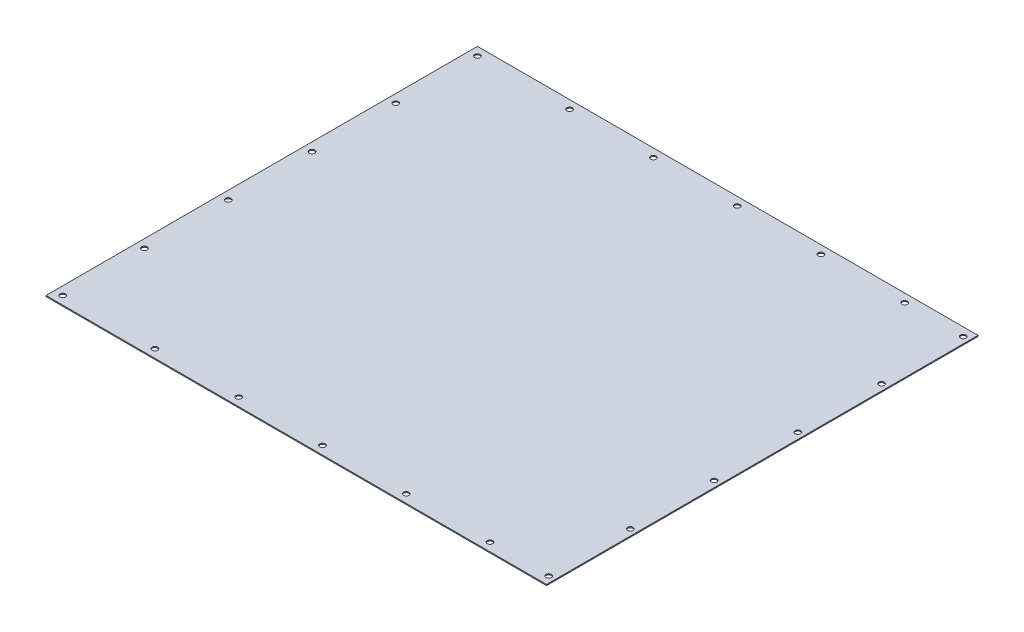
ISO-10303-21;
HEADER;
FILE_DESCRIPTION(('STEP AP214'),'2;1');
FILE_NAME('part.step','',(''),(''),'','','');
FILE_SCHEMA(('AUTOMOTIVE_DESIGN { 1 0 10303 214 1 1 1 1 }'));
ENDSEC;
DATA;
#1=APPLICATION_CONTEXT('core data for automotive mechanical design processes');
#2=APPLICATION_PROTOCOL_DEFINITION('international standard','automotive_design',2000,#1);
#3=PRODUCT_CONTEXT('',#1,'mechanical');
#4=PRODUCT('Part','Part','',(#3));
#5=PRODUCT_RELATED_PRODUCT_CATEGORY('part','',(#4));
#6=PRODUCT_DEFINITION_FORMATION('','',#4);
#7=PRODUCT_DEFINITION_CONTEXT('part definition',#1,'design');
#8=PRODUCT_DEFINITION('design','',#6,#7);
#9=PRODUCT_DEFINITION_SHAPE('','',#8);
#10=(LENGTH_UNIT() NAMED_UNIT(*) SI_UNIT(.MILLI.,.METRE.));
#11=(NAMED_UNIT(*) PLANE_ANGLE_UNIT() SI_UNIT($,.RADIAN.));
#12=(NAMED_UNIT(*) SI_UNIT($,.STERADIAN.) SOLID_ANGLE_UNIT());
#13=UNCERTAINTY_MEASURE_WITH_UNIT(LENGTH_MEASURE(1.E-05),#10,'distance_accuracy_value','');
#14=(GEOMETRIC_REPRESENTATION_CONTEXT(3) GLOBAL_UNCERTAINTY_ASSIGNED_CONTEXT((#13)) GLOBAL_UNIT_ASSIGNED_CONTEXT((#10,
#11,#12)) REPRESENTATION_CONTEXT('',''));
#15=CARTESIAN_POINT('',(0.,0.,0.));
#16=DIRECTION('',(0.,0.,1.));
#17=DIRECTION('',(1.,0.,0.));
#18=AXIS2_PLACEMENT_3D('',#15,#16,#17);
#19=CARTESIAN_POINT('',(749.3,1.5875,-517.525));
#20=DIRECTION('',(0.,1.,0.));
#21=DIRECTION('',(0.,0.,1.));
#22=AXIS2_PLACEMENT_3D('',#19,#20,#21);
#23=CYLINDRICAL_SURFACE('',#22,4.167251);
#24=CARTESIAN_POINT('',(749.3,0.,-517.525));
#25=DIRECTION('',(0.,1.,0.));
#26=DIRECTION('',(0.,0.,1.));
#27=AXIS2_PLACEMENT_3D('',#24,#25,#26);
#28=CIRCLE('',#27,4.167251);
#29=CARTESIAN_POINT('',(749.3,0.,-513.357749));
#30=VERTEX_POINT('',#29);
#31=EDGE_CURVE('E47',#30,#30,#28,.T.);
#32=ORIENTED_EDGE('',*,*,#31,.F.);
#33=EDGE_LOOP('',(#32));
#34=FACE_BOUND('',#33,.T.);
#35=CARTESIAN_POINT('',(749.3,1.5875,-517.525));
#36=DIRECTION('',(0.,1.,0.));
#37=DIRECTION('',(0.,0.,1.));
#38=AXIS2_PLACEMENT_3D('',#35,#36,#37);
#39=CIRCLE('',#38,4.167251);
#40=CARTESIAN_POINT('',(749.3,1.5875,-513.357749));
#41=VERTEX_POINT('',#40);
#42=EDGE_CURVE('E11',#41,#41,#39,.T.);
#43=ORIENTED_EDGE('',*,*,#42,.T.);
#44=EDGE_LOOP('',(#43));
#45=FACE_BOUND('',#44,.T.);
#46=ADVANCED_FACE('F39',(#34,#45),#23,.F.);
#47=CARTESIAN_POINT('',(749.3,1.5875,-390.525));
#48=DIRECTION('',(0.,1.,0.));
#49=DIRECTION('',(0.,0.,1.));
#50=AXIS2_PLACEMENT_3D('',#47,#48,#49);
#51=CYLINDRICAL_SURFACE('',#50,4.167251);
#52=CARTESIAN_POINT('',(749.3,0.,-390.525));
#53=DIRECTION('',(0.,1.,0.));
#54=DIRECTION('',(0.,0.,1.));
#55=AXIS2_PLACEMENT_3D('',#52,#53,#54);
#56=CIRCLE('',#55,4.167251);
#57=CARTESIAN_POINT('',(749.3,0.,-386.357749));
#58=VERTEX_POINT('',#57);
#59=EDGE_CURVE('E201',#58,#58,#56,.T.);
#60=ORIENTED_EDGE('',*,*,#59,.F.);
#61=EDGE_LOOP('',(#60));
#62=FACE_BOUND('',#61,.T.);
#63=CARTESIAN_POINT('',(749.3,1.5875,-390.525));
#64=DIRECTION('',(0.,1.,0.));
#65=DIRECTION('',(0.,0.,1.));
#66=AXIS2_PLACEMENT_3D('',#63,#64,#65);
#67=CIRCLE('',#66,4.167251);
#68=CARTESIAN_POINT('',(749.3,1.5875,-386.357749));
#69=VERTEX_POINT('',#68);
#70=EDGE_CURVE('E204',#69,#69,#67,.T.);
#71=ORIENTED_EDGE('',*,*,#70,.T.);
#72=EDGE_LOOP('',(#71));
#73=FACE_BOUND('',#72,.T.);
#74=ADVANCED_FACE('F213',(#62,#73),#51,.F.);
#75=CARTESIAN_POINT('',(749.3,1.5875,-263.525));
#76=DIRECTION('',(0.,1.,0.));
#77=DIRECTION('',(0.,0.,1.));
#78=AXIS2_PLACEMENT_3D('',#75,#76,#77);
#79=CYLINDRICAL_SURFACE('',#78,4.167251);
#80=CARTESIAN_POINT('',(749.3,0.,-263.525));
#81=DIRECTION('',(0.,1.,0.));
#82=DIRECTION('',(0.,0.,1.));
#83=AXIS2_PLACEMENT_3D('',#80,#81,#82);
#84=CIRCLE('',#83,4.167251);
#85=CARTESIAN_POINT('',(749.3,0.,-259.357749));
#86=VERTEX_POINT('',#85);
#87=EDGE_CURVE('E195',#86,#86,#84,.T.);
#88=ORIENTED_EDGE('',*,*,#87,.F.);
#89=EDGE_LOOP('',(#88));
#90=FACE_BOUND('',#89,.T.);
#91=CARTESIAN_POINT('',(749.3,1.5875,-263.525));
#92=DIRECTION('',(0.,1.,0.));
#93=DIRECTION('',(0.,0.,1.));
#94=AXIS2_PLACEMENT_3D('',#91,#92,#93);
#95=CIRCLE('',#94,4.167251);
#96=CARTESIAN_POINT('',(749.3,1.5875,-259.357749));
#97=VERTEX_POINT('',#96);
#98=EDGE_CURVE('E198',#97,#97,#95,.T.);
#99=ORIENTED_EDGE('',*,*,#98,.T.);
#100=EDGE_LOOP('',(#99));
#101=FACE_BOUND('',#100,.T.);
#102=ADVANCED_FACE('F292',(#90,#101),#79,.F.);
#103=CARTESIAN_POINT('',(749.3,1.5875,-136.525));
#104=DIRECTION('',(0.,1.,0.));
#105=DIRECTION('',(0.,0.,1.));
#106=AXIS2_PLACEMENT_3D('',#103,#104,#105);
#107=CYLINDRICAL_SURFACE('',#106,4.167251);
#108=CARTESIAN_POINT('',(749.3,0.,-136.525));
#109=DIRECTION('',(0.,1.,0.));
#110=DIRECTION('',(0.,0.,1.));
#111=AXIS2_PLACEMENT_3D('',#108,#109,#110);
#112=CIRCLE('',#111,4.167251);
#113=CARTESIAN_POINT('',(749.3,0.,-132.357749));
#114=VERTEX_POINT('',#113);
#115=EDGE_CURVE('E189',#114,#114,#112,.T.);
#116=ORIENTED_EDGE('',*,*,#115,.F.);
#117=EDGE_LOOP('',(#116));
#118=FACE_BOUND('',#117,.T.);
#119=CARTESIAN_POINT('',(749.3,1.5875,-136.525));
#120=DIRECTION('',(0.,1.,0.));
#121=DIRECTION('',(0.,0.,1.));
#122=AXIS2_PLACEMENT_3D('',#119,#120,#121);
#123=CIRCLE('',#122,4.167251);
#124=CARTESIAN_POINT('',(749.3,1.5875,-132.357749));
#125=VERTEX_POINT('',#124);
#126=EDGE_CURVE('E192',#125,#125,#123,.T.);
#127=ORIENTED_EDGE('',*,*,#126,.T.);
#128=EDGE_LOOP('',(#127));
#129=FACE_BOUND('',#128,.T.);
#130=ADVANCED_FACE('F288',(#118,#129),#107,.F.);
#131=CARTESIAN_POINT('',(12.7,1.5875,-517.525));
#132=DIRECTION('',(0.,1.,0.));
#133=DIRECTION('',(0.,0.,1.));
#134=AXIS2_PLACEMENT_3D('',#131,#132,#133);
#135=CYLINDRICAL_SURFACE('',#134,4.167251);
#136=CARTESIAN_POINT('',(12.7,0.,-517.525));
#137=DIRECTION('',(0.,1.,0.));
#138=DIRECTION('',(0.,0.,1.));
#139=AXIS2_PLACEMENT_3D('',#136,#137,#138);
#140=CIRCLE('',#139,4.167251);
#141=CARTESIAN_POINT('',(12.7,0.,-513.357749));
#142=VERTEX_POINT('',#141);
#143=EDGE_CURVE('E183',#142,#142,#140,.T.);
#144=ORIENTED_EDGE('',*,*,#143,.F.);
#145=EDGE_LOOP('',(#144));
#146=FACE_BOUND('',#145,.T.);
#147=CARTESIAN_POINT('',(12.7,1.5875,-517.525));
#148=DIRECTION('',(0.,1.,0.));
#149=DIRECTION('',(0.,0.,1.));
#150=AXIS2_PLACEMENT_3D('',#147,#148,#149);
#151=CIRCLE('',#150,4.167251);
#152=CARTESIAN_POINT('',(12.7,1.5875,-513.357749));
#153=VERTEX_POINT('',#152);
#154=EDGE_CURVE('E186',#153,#153,#151,.T.);
#155=ORIENTED_EDGE('',*,*,#154,.T.);
#156=EDGE_LOOP('',(#155));
#157=FACE_BOUND('',#156,.T.);
#158=ADVANCED_FACE('F284',(#146,#157),#135,.F.);
#159=CARTESIAN_POINT('',(12.7,1.5875,-390.525));
#160=DIRECTION('',(0.,1.,0.));
#161=DIRECTION('',(0.,0.,1.));
#162=AXIS2_PLACEMENT_3D('',#159,#160,#161);
#163=CYLINDRICAL_SURFACE('',#162,4.167251);
#164=CARTESIAN_POINT('',(12.7,0.,-390.525));
#165=DIRECTION('',(0.,1.,0.));
#166=DIRECTION('',(0.,0.,1.));
#167=AXIS2_PLACEMENT_3D('',#164,#165,#166);
#168=CIRCLE('',#167,4.167251);
#169=CARTESIAN_POINT('',(12.7,0.,-386.357749));
#170=VERTEX_POINT('',#169);
#171=EDGE_CURVE('E177',#170,#170,#168,.T.);
#172=ORIENTED_EDGE('',*,*,#171,.F.);
#173=EDGE_LOOP('',(#172));
#174=FACE_BOUND('',#173,.T.);
#175=CARTESIAN_POINT('',(12.7,1.5875,-390.525));
#176=DIRECTION('',(0.,1.,0.));
#177=DIRECTION('',(0.,0.,1.));
#178=AXIS2_PLACEMENT_3D('',#175,#176,#177);
#179=CIRCLE('',#178,4.167251);
#180=CARTESIAN_POINT('',(12.7,1.5875,-386.357749));
#181=VERTEX_POINT('',#180);
#182=EDGE_CURVE('E180',#181,#181,#179,.T.);
#183=ORIENTED_EDGE('',*,*,#182,.T.);
#184=EDGE_LOOP('',(#183));
#185=FACE_BOUND('',#184,.T.);
#186=ADVANCED_FACE('F281',(#174,#185),#163,.F.);
#187=CARTESIAN_POINT('',(660.4,1.5875,-641.35));
#188=DIRECTION('',(0.,1.,0.));
#189=DIRECTION('',(0.,0.,1.));
#190=AXIS2_PLACEMENT_3D('',#187,#188,#189);
#191=CYLINDRICAL_SURFACE('',#190,4.16725100000001);
#192=CARTESIAN_POINT('',(660.4,0.,-641.35));
#193=DIRECTION('',(0.,1.,0.));
#194=DIRECTION('',(0.,0.,1.));
#195=AXIS2_PLACEMENT_3D('',#192,#193,#194);
#196=CIRCLE('',#195,4.16725100000001);
#197=CARTESIAN_POINT('',(660.4,0.,-637.182749));
#198=VERTEX_POINT('',#197);
#199=EDGE_CURVE('E171',#198,#198,#196,.T.);
#200=ORIENTED_EDGE('',*,*,#199,.F.);
#201=EDGE_LOOP('',(#200));
#202=FACE_BOUND('',#201,.T.);
#203=CARTESIAN_POINT('',(660.4,1.5875,-641.35));
#204=DIRECTION('',(0.,1.,0.));
#205=DIRECTION('',(0.,0.,1.));
#206=AXIS2_PLACEMENT_3D('',#203,#204,#205);
#207=CIRCLE('',#206,4.16725100000001);
#208=CARTESIAN_POINT('',(660.4,1.5875,-637.182749));
#209=VERTEX_POINT('',#208);
#210=EDGE_CURVE('E174',#209,#209,#207,.T.);
#211=ORIENTED_EDGE('',*,*,#210,.T.);
#212=EDGE_LOOP('',(#211));
#213=FACE_BOUND('',#212,.T.);
#214=ADVANCED_FACE('F277',(#202,#213),#191,.F.);
#215=CARTESIAN_POINT('',(533.4,1.5875,-641.35));
#216=DIRECTION('',(0.,1.,0.));
#217=DIRECTION('',(0.,0.,1.));
#218=AXIS2_PLACEMENT_3D('',#215,#216,#217);
#219=CYLINDRICAL_SURFACE('',#218,4.16725100000001);
#220=CARTESIAN_POINT('',(533.4,0.,-641.35));
#221=DIRECTION('',(0.,1.,0.));
#222=DIRECTION('',(0.,0.,1.));
#223=AXIS2_PLACEMENT_3D('',#220,#221,#222);
#224=CIRCLE('',#223,4.16725100000001);
#225=CARTESIAN_POINT('',(533.4,0.,-637.182749));
#226=VERTEX_POINT('',#225);
#227=EDGE_CURVE('E165',#226,#226,#224,.T.);
#228=ORIENTED_EDGE('',*,*,#227,.F.);
#229=EDGE_LOOP('',(#228));
#230=FACE_BOUND('',#229,.T.);
#231=CARTESIAN_POINT('',(533.4,1.5875,-641.35));
#232=DIRECTION('',(0.,1.,0.));
#233=DIRECTION('',(0.,0.,1.));
#234=AXIS2_PLACEMENT_3D('',#231,#232,#233);
#235=CIRCLE('',#234,4.16725100000001);
#236=CARTESIAN_POINT('',(533.4,1.5875,-637.182749));
#237=VERTEX_POINT('',#236);
#238=EDGE_CURVE('E168',#237,#237,#235,.T.);
#239=ORIENTED_EDGE('',*,*,#238,.T.);
#240=EDGE_LOOP('',(#239));
#241=FACE_BOUND('',#240,.T.);
#242=ADVANCED_FACE('F273',(#230,#241),#219,.F.);
#243=CARTESIAN_POINT('',(406.4,1.5875,-641.35));
#244=DIRECTION('',(0.,1.,0.));
#245=DIRECTION('',(0.,0.,1.));
#246=AXIS2_PLACEMENT_3D('',#243,#244,#245);
#247=CYLINDRICAL_SURFACE('',#246,4.16725100000001);
#248=CARTESIAN_POINT('',(406.4,0.,-641.35));
#249=DIRECTION('',(0.,1.,0.));
#250=DIRECTION('',(0.,0.,1.));
#251=AXIS2_PLACEMENT_3D('',#248,#249,#250);
#252=CIRCLE('',#251,4.16725100000001);
#253=CARTESIAN_POINT('',(406.4,0.,-637.182749));
#254=VERTEX_POINT('',#253);
#255=EDGE_CURVE('E159',#254,#254,#252,.T.);
#256=ORIENTED_EDGE('',*,*,#255,.F.);
#257=EDGE_LOOP('',(#256));
#258=FACE_BOUND('',#257,.T.);
#259=CARTESIAN_POINT('',(406.4,1.5875,-641.35));
#260=DIRECTION('',(0.,1.,0.));
#261=DIRECTION('',(0.,0.,1.));
#262=AXIS2_PLACEMENT_3D('',#259,#260,#261);
#263=CIRCLE('',#262,4.16725100000001);
#264=CARTESIAN_POINT('',(406.4,1.5875,-637.182749));
#265=VERTEX_POINT('',#264);
#266=EDGE_CURVE('E162',#265,#265,#263,.T.);
#267=ORIENTED_EDGE('',*,*,#266,.T.);
#268=EDGE_LOOP('',(#267));
#269=FACE_BOUND('',#268,.T.);
#270=ADVANCED_FACE('F269',(#258,#269),#247,.F.);
#271=CARTESIAN_POINT('',(279.4,1.5875,-641.35));
#272=DIRECTION('',(0.,1.,0.));
#273=DIRECTION('',(0.,0.,1.));
#274=AXIS2_PLACEMENT_3D('',#271,#272,#273);
#275=CYLINDRICAL_SURFACE('',#274,4.16725100000001);
#276=CARTESIAN_POINT('',(279.4,0.,-641.35));
#277=DIRECTION('',(0.,1.,0.));
#278=DIRECTION('',(0.,0.,1.));
#279=AXIS2_PLACEMENT_3D('',#276,#277,#278);
#280=CIRCLE('',#279,4.16725100000001);
#281=CARTESIAN_POINT('',(279.4,0.,-637.182749));
#282=VERTEX_POINT('',#281);
#283=EDGE_CURVE('E153',#282,#282,#280,.T.);
#284=ORIENTED_EDGE('',*,*,#283,.F.);
#285=EDGE_LOOP('',(#284));
#286=FACE_BOUND('',#285,.T.);
#287=CARTESIAN_POINT('',(279.4,1.5875,-641.35));
#288=DIRECTION('',(0.,1.,0.));
#289=DIRECTION('',(0.,0.,1.));
#290=AXIS2_PLACEMENT_3D('',#287,#288,#289);
#291=CIRCLE('',#290,4.16725100000001);
#292=CARTESIAN_POINT('',(279.4,1.5875,-637.182749));
#293=VERTEX_POINT('',#292);
#294=EDGE_CURVE('E156',#293,#293,#291,.T.);
#295=ORIENTED_EDGE('',*,*,#294,.T.);
#296=EDGE_LOOP('',(#295));
#297=FACE_BOUND('',#296,.T.);
#298=ADVANCED_FACE('F265',(#286,#297),#275,.F.);
#299=CARTESIAN_POINT('',(152.4,1.5875,-641.35));
#300=DIRECTION('',(0.,1.,0.));
#301=DIRECTION('',(0.,0.,1.));
#302=AXIS2_PLACEMENT_3D('',#299,#300,#301);
#303=CYLINDRICAL_SURFACE('',#302,4.16725100000001);
#304=CARTESIAN_POINT('',(152.4,0.,-641.35));
#305=DIRECTION('',(0.,1.,0.));
#306=DIRECTION('',(0.,0.,1.));
#307=AXIS2_PLACEMENT_3D('',#304,#305,#306);
#308=CIRCLE('',#307,4.16725100000001);
#309=CARTESIAN_POINT('',(152.4,0.,-637.182749));
#310=VERTEX_POINT('',#309);
#311=EDGE_CURVE('E147',#310,#310,#308,.T.);
#312=ORIENTED_EDGE('',*,*,#311,.F.);
#313=EDGE_LOOP('',(#312));
#314=FACE_BOUND('',#313,.T.);
#315=CARTESIAN_POINT('',(152.4,1.5875,-641.35));
#316=DIRECTION('',(0.,1.,0.));
#317=DIRECTION('',(0.,0.,1.));
#318=AXIS2_PLACEMENT_3D('',#315,#316,#317);
#319=CIRCLE('',#318,4.16725100000001);
#320=CARTESIAN_POINT('',(152.4,1.5875,-637.182749));
#321=VERTEX_POINT('',#320);
#322=EDGE_CURVE('E150',#321,#321,#319,.T.);
#323=ORIENTED_EDGE('',*,*,#322,.T.);
#324=EDGE_LOOP('',(#323));
#325=FACE_BOUND('',#324,.T.);
#326=ADVANCED_FACE('F261',(#314,#325),#303,.F.);
#327=CARTESIAN_POINT('',(660.4,1.5875,-12.7));
#328=DIRECTION('',(0.,1.,0.));
#329=DIRECTION('',(0.,0.,1.));
#330=AXIS2_PLACEMENT_3D('',#327,#328,#329);
#331=CYLINDRICAL_SURFACE('',#330,4.16725100000001);
#332=CARTESIAN_POINT('',(660.4,0.,-12.7));
#333=DIRECTION('',(0.,1.,0.));
#334=DIRECTION('',(0.,0.,1.));
#335=AXIS2_PLACEMENT_3D('',#332,#333,#334);
#336=CIRCLE('',#335,4.16725100000001);
#337=CARTESIAN_POINT('',(660.4,0.,-8.53274899999999));
#338=VERTEX_POINT('',#337);
#339=EDGE_CURVE('E141',#338,#338,#336,.T.);
#340=ORIENTED_EDGE('',*,*,#339,.F.);
#341=EDGE_LOOP('',(#340));
#342=FACE_BOUND('',#341,.T.);
#343=CARTESIAN_POINT('',(660.4,1.5875,-12.7));
#344=DIRECTION('',(0.,1.,0.));
#345=DIRECTION('',(0.,0.,1.));
#346=AXIS2_PLACEMENT_3D('',#343,#344,#345);
#347=CIRCLE('',#346,4.16725100000001);
#348=CARTESIAN_POINT('',(660.4,1.5875,-8.53274899999999));
#349=VERTEX_POINT('',#348);
#350=EDGE_CURVE('E144',#349,#349,#347,.T.);
#351=ORIENTED_EDGE('',*,*,#350,.T.);
#352=EDGE_LOOP('',(#351));
#353=FACE_BOUND('',#352,.T.);
#354=ADVANCED_FACE('F257',(#342,#353),#331,.F.);
#355=CARTESIAN_POINT('',(533.4,1.5875,-12.7));
#356=DIRECTION('',(0.,1.,0.));
#357=DIRECTION('',(0.,0.,1.));
#358=AXIS2_PLACEMENT_3D('',#355,#356,#357);
#359=CYLINDRICAL_SURFACE('',#358,4.16725100000001);
#360=CARTESIAN_POINT('',(533.4,0.,-12.7));
#361=DIRECTION('',(0.,1.,0.));
#362=DIRECTION('',(0.,0.,1.));
#363=AXIS2_PLACEMENT_3D('',#360,#361,#362);
#364=CIRCLE('',#363,4.16725100000001);
#365=CARTESIAN_POINT('',(533.4,0.,-8.53274899999999));
#366=VERTEX_POINT('',#365);
#367=EDGE_CURVE('E135',#366,#366,#364,.T.);
#368=ORIENTED_EDGE('',*,*,#367,.F.);
#369=EDGE_LOOP('',(#368));
#370=FACE_BOUND('',#369,.T.);
#371=CARTESIAN_POINT('',(533.4,1.5875,-12.7));
#372=DIRECTION('',(0.,1.,0.));
#373=DIRECTION('',(0.,0.,1.));
#374=AXIS2_PLACEMENT_3D('',#371,#372,#373);
#375=CIRCLE('',#374,4.16725100000001);
#376=CARTESIAN_POINT('',(533.4,1.5875,-8.53274899999999));
#377=VERTEX_POINT('',#376);
#378=EDGE_CURVE('E138',#377,#377,#375,.T.);
#379=ORIENTED_EDGE('',*,*,#378,.T.);
#380=EDGE_LOOP('',(#379));
#381=FACE_BOUND('',#380,.T.);
#382=ADVANCED_FACE('F253',(#370,#381),#359,.F.);
#383=CARTESIAN_POINT('',(406.4,1.5875,-12.7));
#384=DIRECTION('',(0.,1.,0.));
#385=DIRECTION('',(0.,0.,1.));
#386=AXIS2_PLACEMENT_3D('',#383,#384,#385);
#387=CYLINDRICAL_SURFACE('',#386,4.16725100000001);
#388=CARTESIAN_POINT('',(406.4,0.,-12.7));
#389=DIRECTION('',(0.,1.,0.));
#390=DIRECTION('',(0.,0.,1.));
#391=AXIS2_PLACEMENT_3D('',#388,#389,#390);
#392=CIRCLE('',#391,4.16725100000001);
#393=CARTESIAN_POINT('',(406.4,0.,-8.53274899999999));
#394=VERTEX_POINT('',#393);
#395=EDGE_CURVE('E129',#394,#394,#392,.T.);
#396=ORIENTED_EDGE('',*,*,#395,.F.);
#397=EDGE_LOOP('',(#396));
#398=FACE_BOUND('',#397,.T.);
#399=CARTESIAN_POINT('',(406.4,1.5875,-12.7));
#400=DIRECTION('',(0.,1.,0.));
#401=DIRECTION('',(0.,0.,1.));
#402=AXIS2_PLACEMENT_3D('',#399,#400,#401);
#403=CIRCLE('',#402,4.16725100000001);
#404=CARTESIAN_POINT('',(406.4,1.5875,-8.53274899999999));
#405=VERTEX_POINT('',#404);
#406=EDGE_CURVE('E132',#405,#405,#403,.T.);
#407=ORIENTED_EDGE('',*,*,#406,.T.);
#408=EDGE_LOOP('',(#407));
#409=FACE_BOUND('',#408,.T.);
#410=ADVANCED_FACE('F249',(#398,#409),#387,.F.);
#411=CARTESIAN_POINT('',(749.3,1.5875,-641.35));
#412=DIRECTION('',(0.,1.,0.));
#413=DIRECTION('',(0.,0.,1.));
#414=AXIS2_PLACEMENT_3D('',#411,#412,#413);
#415=CYLINDRICAL_SURFACE('',#414,4.167251);
#416=CARTESIAN_POINT('',(749.3,0.,-641.35));
#417=DIRECTION('',(0.,1.,0.));
#418=DIRECTION('',(0.,0.,1.));
#419=AXIS2_PLACEMENT_3D('',#416,#417,#418);
#420=CIRCLE('',#419,4.167251);
#421=CARTESIAN_POINT('',(749.3,0.,-637.182749));
#422=VERTEX_POINT('',#421);
#423=EDGE_CURVE('E123',#422,#422,#420,.T.);
#424=ORIENTED_EDGE('',*,*,#423,.F.);
#425=EDGE_LOOP('',(#424));
#426=FACE_BOUND('',#425,.T.);
#427=CARTESIAN_POINT('',(749.3,1.5875,-641.35));
#428=DIRECTION('',(0.,1.,0.));
#429=DIRECTION('',(0.,0.,1.));
#430=AXIS2_PLACEMENT_3D('',#427,#428,#429);
#431=CIRCLE('',#430,4.167251);
#432=CARTESIAN_POINT('',(749.3,1.5875,-637.182749));
#433=VERTEX_POINT('',#432);
#434=EDGE_CURVE('E126',#433,#433,#431,.T.);
#435=ORIENTED_EDGE('',*,*,#434,.T.);
#436=EDGE_LOOP('',(#435));
#437=FACE_BOUND('',#436,.T.);
#438=ADVANCED_FACE('F245',(#426,#437),#415,.F.);
#439=CARTESIAN_POINT('',(12.7,1.5875,-641.35));
#440=DIRECTION('',(0.,1.,0.));
#441=DIRECTION('',(0.,0.,1.));
#442=AXIS2_PLACEMENT_3D('',#439,#440,#441);
#443=CYLINDRICAL_SURFACE('',#442,4.167251);
#444=CARTESIAN_POINT('',(12.7,0.,-641.35));
#445=DIRECTION('',(0.,1.,0.));
#446=DIRECTION('',(0.,0.,1.));
#447=AXIS2_PLACEMENT_3D('',#444,#445,#446);
#448=CIRCLE('',#447,4.167251);
#449=CARTESIAN_POINT('',(12.7,0.,-637.182749));
#450=VERTEX_POINT('',#449);
#451=EDGE_CURVE('E117',#450,#450,#448,.T.);
#452=ORIENTED_EDGE('',*,*,#451,.F.);
#453=EDGE_LOOP('',(#452));
#454=FACE_BOUND('',#453,.T.);
#455=CARTESIAN_POINT('',(12.7,1.5875,-641.35));
#456=DIRECTION('',(0.,1.,0.));
#457=DIRECTION('',(0.,0.,1.));
#458=AXIS2_PLACEMENT_3D('',#455,#456,#457);
#459=CIRCLE('',#458,4.167251);
#460=CARTESIAN_POINT('',(12.7,1.5875,-637.182749));
#461=VERTEX_POINT('',#460);
#462=EDGE_CURVE('E120',#461,#461,#459,.T.);
#463=ORIENTED_EDGE('',*,*,#462,.T.);
#464=EDGE_LOOP('',(#463));
#465=FACE_BOUND('',#464,.T.);
#466=ADVANCED_FACE('F241',(#454,#465),#443,.F.);
#467=CARTESIAN_POINT('',(0.,1.5875,0.));
#468=DIRECTION('',(1.,0.,0.));
#469=DIRECTION('',(0.,0.,-1.));
#470=AXIS2_PLACEMENT_3D('',#467,#468,#469);
#471=PLANE('',#470);
#472=DIRECTION('',(0.,0.,1.));
#473=VECTOR('',#472,1.);
#474=CARTESIAN_POINT('',(0.,0.,0.));
#475=LINE('',#474,#473);
#476=CARTESIAN_POINT('',(0.,0.,-654.05));
#477=VERTEX_POINT('',#476);
#478=CARTESIAN_POINT('',(0.,0.,0.));
#479=VERTEX_POINT('',#478);
#480=EDGE_CURVE('E107',#477,#479,#475,.T.);
#481=ORIENTED_EDGE('',*,*,#480,.T.);
#482=DIRECTION('',(0.,-1.,0.));
#483=VECTOR('',#482,1.);
#484=CARTESIAN_POINT('',(0.,1.5875,0.));
#485=LINE('',#484,#483);
#486=CARTESIAN_POINT('',(0.,1.5875,0.));
#487=VERTEX_POINT('',#486);
#488=EDGE_CURVE('E98',#487,#479,#485,.T.);
#489=ORIENTED_EDGE('',*,*,#488,.F.);
#490=DIRECTION('',(0.,0.,1.));
#491=VECTOR('',#490,1.);
#492=CARTESIAN_POINT('',(0.,1.5875,0.));
#493=LINE('',#492,#491);
#494=CARTESIAN_POINT('',(0.,1.5875,-654.05));
#495=VERTEX_POINT('',#494);
#496=EDGE_CURVE('E92',#495,#487,#493,.T.);
#497=ORIENTED_EDGE('',*,*,#496,.F.);
#498=DIRECTION('',(0.,-1.,0.));
#499=VECTOR('',#498,1.);
#500=CARTESIAN_POINT('',(0.,1.5875,-654.05));
#501=LINE('',#500,#499);
#502=EDGE_CURVE('E103',#495,#477,#501,.T.);
#503=ORIENTED_EDGE('',*,*,#502,.T.);
#504=EDGE_LOOP('',(#481,#489,#497,#503));
#505=FACE_BOUND('',#504,.T.);
#506=ADVANCED_FACE('F238',(#505),#471,.F.);
#507=CARTESIAN_POINT('',(0.,1.5875,0.));
#508=DIRECTION('',(0.,0.,-1.));
#509=DIRECTION('',(-1.,0.,0.));
#510=AXIS2_PLACEMENT_3D('',#507,#508,#509);
#511=PLANE('',#510);
#512=DIRECTION('',(1.,0.,0.));
#513=VECTOR('',#512,1.);
#514=CARTESIAN_POINT('',(0.,0.,0.));
#515=LINE('',#514,#513);
#516=CARTESIAN_POINT('',(758.825,0.,0.));
#517=VERTEX_POINT('',#516);
#518=EDGE_CURVE('E97',#479,#517,#515,.T.);
#519=ORIENTED_EDGE('',*,*,#518,.T.);
#520=DIRECTION('',(0.,-1.,0.));
#521=VECTOR('',#520,1.);
#522=CARTESIAN_POINT('',(758.825,1.5875,0.));
#523=LINE('',#522,#521);
#524=CARTESIAN_POINT('',(758.825,1.5875,0.));
#525=VERTEX_POINT('',#524);
#526=EDGE_CURVE('E95',#525,#517,#523,.T.);
#527=ORIENTED_EDGE('',*,*,#526,.F.);
#528=DIRECTION('',(1.,0.,0.));
#529=VECTOR('',#528,1.);
#530=CARTESIAN_POINT('',(0.,1.5875,0.));
#531=LINE('',#530,#529);
#532=EDGE_CURVE('E86',#487,#525,#531,.T.);
#533=ORIENTED_EDGE('',*,*,#532,.F.);
#534=ORIENTED_EDGE('',*,*,#488,.T.);
#535=EDGE_LOOP('',(#519,#527,#533,#534));
#536=FACE_BOUND('',#535,.T.);
#537=ADVANCED_FACE('F96',(#536),#511,.F.);
#538=CARTESIAN_POINT('',(758.825,1.5875,0.));
#539=DIRECTION('',(-1.,0.,0.));
#540=DIRECTION('',(0.,0.,1.));
#541=AXIS2_PLACEMENT_3D('',#538,#539,#540);
#542=PLANE('',#541);
#543=DIRECTION('',(0.,0.,-1.));
#544=VECTOR('',#543,1.);
#545=CARTESIAN_POINT('',(758.825,0.,0.));
#546=LINE('',#545,#544);
#547=CARTESIAN_POINT('',(758.825,0.,-654.05));
#548=VERTEX_POINT('',#547);
#549=EDGE_CURVE('E72',#517,#548,#546,.T.);
#550=ORIENTED_EDGE('',*,*,#549,.T.);
#551=DIRECTION('',(0.,-1.,0.));
#552=VECTOR('',#551,1.);
#553=CARTESIAN_POINT('',(758.825,1.5875,-654.05));
#554=LINE('',#553,#552);
#555=CARTESIAN_POINT('',(758.825,1.5875,-654.05));
#556=VERTEX_POINT('',#555);
#557=EDGE_CURVE('E99',#556,#548,#554,.T.);
#558=ORIENTED_EDGE('',*,*,#557,.F.);
#559=DIRECTION('',(0.,0.,-1.));
#560=VECTOR('',#559,1.);
#561=CARTESIAN_POINT('',(758.825,1.5875,0.));
#562=LINE('',#561,#560);
#563=EDGE_CURVE('E90',#525,#556,#562,.T.);
#564=ORIENTED_EDGE('',*,*,#563,.F.);
#565=ORIENTED_EDGE('',*,*,#526,.T.);
#566=EDGE_LOOP('',(#550,#558,#564,#565));
#567=FACE_BOUND('',#566,.T.);
#568=ADVANCED_FACE('F101',(#567),#542,.F.);
#569=CARTESIAN_POINT('',(0.,1.5875,-654.05));
#570=DIRECTION('',(0.,0.,1.));
#571=DIRECTION('',(1.,0.,0.));
#572=AXIS2_PLACEMENT_3D('',#569,#570,#571);
#573=PLANE('',#572);
#574=DIRECTION('',(-1.,0.,0.));
#575=VECTOR('',#574,1.);
#576=CARTESIAN_POINT('',(0.,0.,-654.05));
#577=LINE('',#576,#575);
#578=EDGE_CURVE('E78',#548,#477,#577,.T.);
#579=ORIENTED_EDGE('',*,*,#578,.T.);
#580=ORIENTED_EDGE('',*,*,#502,.F.);
#581=DIRECTION('',(-1.,0.,0.));
#582=VECTOR('',#581,1.);
#583=CARTESIAN_POINT('',(0.,1.5875,-654.05));
#584=LINE('',#583,#582);
#585=EDGE_CURVE('E55',#556,#495,#584,.T.);
#586=ORIENTED_EDGE('',*,*,#585,.F.);
#587=ORIENTED_EDGE('',*,*,#557,.T.);
#588=EDGE_LOOP('',(#579,#580,#586,#587));
#589=FACE_BOUND('',#588,.T.);
#590=ADVANCED_FACE('F217',(#589),#573,.F.);
#591=CARTESIAN_POINT('',(0.,1.5875,0.));
#592=DIRECTION('',(0.,-1.,0.));
#593=DIRECTION('',(0.,0.,-1.));
#594=AXIS2_PLACEMENT_3D('',#591,#592,#593);
#595=PLANE('',#594);
#596=CARTESIAN_POINT('',(12.7,1.5875,-263.525));
#597=DIRECTION('',(0.,1.,0.));
#598=DIRECTION('',(0.,0.,1.));
#599=AXIS2_PLACEMENT_3D('',#596,#597,#598);
#600=CIRCLE('',#599,4.167251);
#601=CARTESIAN_POINT('',(12.7,1.5875,-259.357749));
#602=VERTEX_POINT('',#601);
#603=EDGE_CURVE('E426',#602,#602,#600,.T.);
#604=ORIENTED_EDGE('',*,*,#603,.F.);
#605=EDGE_LOOP('',(#604));
#606=FACE_BOUND('',#605,.T.);
#607=CARTESIAN_POINT('',(12.7,1.5875,-136.525));
#608=DIRECTION('',(0.,1.,0.));
#609=DIRECTION('',(0.,0.,1.));
#610=AXIS2_PLACEMENT_3D('',#607,#608,#609);
#611=CIRCLE('',#610,4.167251);
#612=CARTESIAN_POINT('',(12.7,1.5875,-132.357749));
#613=VERTEX_POINT('',#612);
#614=EDGE_CURVE('E425',#613,#613,#611,.T.);
#615=ORIENTED_EDGE('',*,*,#614,.F.);
#616=EDGE_LOOP('',(#615));
#617=FACE_BOUND('',#616,.T.);
#618=CARTESIAN_POINT('',(279.4,1.5875,-12.7));
#619=DIRECTION('',(0.,1.,0.));
#620=DIRECTION('',(0.,0.,1.));
#621=AXIS2_PLACEMENT_3D('',#618,#619,#620);
#622=CIRCLE('',#621,4.16725100000001);
#623=CARTESIAN_POINT('',(279.4,1.5875,-8.53274899999999));
#624=VERTEX_POINT('',#623);
#625=EDGE_CURVE('E437',#624,#624,#622,.T.);
#626=ORIENTED_EDGE('',*,*,#625,.F.);
#627=EDGE_LOOP('',(#626));
#628=FACE_BOUND('',#627,.T.);
#629=CARTESIAN_POINT('',(152.4,1.5875,-12.7));
#630=DIRECTION('',(0.,1.,0.));
#631=DIRECTION('',(0.,0.,1.));
#632=AXIS2_PLACEMENT_3D('',#629,#630,#631);
#633=CIRCLE('',#632,4.16725100000001);
#634=CARTESIAN_POINT('',(152.4,1.5875,-8.53274899999999));
#635=VERTEX_POINT('',#634);
#636=EDGE_CURVE('E440',#635,#635,#633,.T.);
#637=ORIENTED_EDGE('',*,*,#636,.F.);
#638=EDGE_LOOP('',(#637));
#639=FACE_BOUND('',#638,.T.);
#640=CARTESIAN_POINT('',(749.3,1.5875,-12.7));
#641=DIRECTION('',(0.,1.,0.));
#642=DIRECTION('',(0.,0.,1.));
#643=AXIS2_PLACEMENT_3D('',#640,#641,#642);
#644=CIRCLE('',#643,4.167251);
#645=CARTESIAN_POINT('',(749.3,1.5875,-8.532749));
#646=VERTEX_POINT('',#645);
#647=EDGE_CURVE('E449',#646,#646,#644,.T.);
#648=ORIENTED_EDGE('',*,*,#647,.F.);
#649=EDGE_LOOP('',(#648));
#650=FACE_BOUND('',#649,.T.);
#651=CARTESIAN_POINT('',(12.7,1.5875,-12.7));
#652=DIRECTION('',(0.,1.,0.));
#653=DIRECTION('',(0.,0.,1.));
#654=AXIS2_PLACEMENT_3D('',#651,#652,#653);
#655=CIRCLE('',#654,4.167251);
#656=CARTESIAN_POINT('',(12.7,1.5875,-8.532749));
#657=VERTEX_POINT('',#656);
#658=EDGE_CURVE('E452',#657,#657,#655,.T.);
#659=ORIENTED_EDGE('',*,*,#658,.F.);
#660=EDGE_LOOP('',(#659));
#661=FACE_BOUND('',#660,.T.);
#662=ORIENTED_EDGE('',*,*,#496,.T.);
#663=ORIENTED_EDGE('',*,*,#532,.T.);
#664=ORIENTED_EDGE('',*,*,#563,.T.);
#665=ORIENTED_EDGE('',*,*,#585,.T.);
#666=EDGE_LOOP('',(#662,#663,#664,#665));
#667=FACE_BOUND('',#666,.T.);
#668=ORIENTED_EDGE('',*,*,#462,.F.);
#669=EDGE_LOOP('',(#668));
#670=FACE_BOUND('',#669,.T.);
#671=ORIENTED_EDGE('',*,*,#434,.F.);
#672=EDGE_LOOP('',(#671));
#673=FACE_BOUND('',#672,.T.);
#674=ORIENTED_EDGE('',*,*,#406,.F.);
#675=EDGE_LOOP('',(#674));
#676=FACE_BOUND('',#675,.T.);
#677=ORIENTED_EDGE('',*,*,#378,.F.);
#678=EDGE_LOOP('',(#677));
#679=FACE_BOUND('',#678,.T.);
#680=ORIENTED_EDGE('',*,*,#350,.F.);
#681=EDGE_LOOP('',(#680));
#682=FACE_BOUND('',#681,.T.);
#683=ORIENTED_EDGE('',*,*,#322,.F.);
#684=EDGE_LOOP('',(#683));
#685=FACE_BOUND('',#684,.T.);
#686=ORIENTED_EDGE('',*,*,#294,.F.);
#687=EDGE_LOOP('',(#686));
#688=FACE_BOUND('',#687,.T.);
#689=ORIENTED_EDGE('',*,*,#266,.F.);
#690=EDGE_LOOP('',(#689));
#691=FACE_BOUND('',#690,.T.);
#692=ORIENTED_EDGE('',*,*,#238,.F.);
#693=EDGE_LOOP('',(#692));
#694=FACE_BOUND('',#693,.T.);
#695=ORIENTED_EDGE('',*,*,#210,.F.);
#696=EDGE_LOOP('',(#695));
#697=FACE_BOUND('',#696,.T.);
#698=ORIENTED_EDGE('',*,*,#182,.F.);
#699=EDGE_LOOP('',(#698));
#700=FACE_BOUND('',#699,.T.);
#701=ORIENTED_EDGE('',*,*,#154,.F.);
#702=EDGE_LOOP('',(#701));
#703=FACE_BOUND('',#702,.T.);
#704=ORIENTED_EDGE('',*,*,#126,.F.);
#705=EDGE_LOOP('',(#704));
#706=FACE_BOUND('',#705,.T.);
#707=ORIENTED_EDGE('',*,*,#98,.F.);
#708=EDGE_LOOP('',(#707));
#709=FACE_BOUND('',#708,.T.);
#710=ORIENTED_EDGE('',*,*,#70,.F.);
#711=EDGE_LOOP('',(#710));
#712=FACE_BOUND('',#711,.T.);
#713=ORIENTED_EDGE('',*,*,#42,.F.);
#714=EDGE_LOOP('',(#713));
#715=FACE_BOUND('',#714,.T.);
#716=ADVANCED_FACE('F87',(#606,#617,#628,#639,#650,#661,#667,#670,#673,#676,#679,#682,#685,#688,
#691,#694,#697,#700,#703,#706,#709,#712,#715),#595,.F.);
#717=CARTESIAN_POINT('',(0.,0.,0.));
#718=DIRECTION('',(0.,-1.,0.));
#719=DIRECTION('',(0.,0.,-1.));
#720=AXIS2_PLACEMENT_3D('',#717,#718,#719);
#721=PLANE('',#720);
#722=CARTESIAN_POINT('',(12.7,0.,-263.525));
#723=DIRECTION('',(0.,1.,0.));
#724=DIRECTION('',(0.,0.,1.));
#725=AXIS2_PLACEMENT_3D('',#722,#723,#724);
#726=CIRCLE('',#725,4.167251);
#727=CARTESIAN_POINT('',(12.7,0.,-259.357749));
#728=VERTEX_POINT('',#727);
#729=EDGE_CURVE('E431',#728,#728,#726,.T.);
#730=ORIENTED_EDGE('',*,*,#729,.T.);
#731=EDGE_LOOP('',(#730));
#732=FACE_BOUND('',#731,.T.);
#733=CARTESIAN_POINT('',(12.7,0.,-136.525));
#734=DIRECTION('',(0.,1.,0.));
#735=DIRECTION('',(0.,0.,1.));
#736=AXIS2_PLACEMENT_3D('',#733,#734,#735);
#737=CIRCLE('',#736,4.167251);
#738=CARTESIAN_POINT('',(12.7,0.,-132.357749));
#739=VERTEX_POINT('',#738);
#740=EDGE_CURVE('E422',#739,#739,#737,.T.);
#741=ORIENTED_EDGE('',*,*,#740,.T.);
#742=EDGE_LOOP('',(#741));
#743=FACE_BOUND('',#742,.T.);
#744=CARTESIAN_POINT('',(279.4,0.,-12.7));
#745=DIRECTION('',(0.,1.,0.));
#746=DIRECTION('',(0.,0.,1.));
#747=AXIS2_PLACEMENT_3D('',#744,#745,#746);
#748=CIRCLE('',#747,4.16725100000001);
#749=CARTESIAN_POINT('',(279.4,0.,-8.53274899999999));
#750=VERTEX_POINT('',#749);
#751=EDGE_CURVE('E428',#750,#750,#748,.T.);
#752=ORIENTED_EDGE('',*,*,#751,.T.);
#753=EDGE_LOOP('',(#752));
#754=FACE_BOUND('',#753,.T.);
#755=CARTESIAN_POINT('',(152.4,0.,-12.7));
#756=DIRECTION('',(0.,1.,0.));
#757=DIRECTION('',(0.,0.,1.));
#758=AXIS2_PLACEMENT_3D('',#755,#756,#757);
#759=CIRCLE('',#758,4.16725100000001);
#760=CARTESIAN_POINT('',(152.4,0.,-8.53274899999999));
#761=VERTEX_POINT('',#760);
#762=EDGE_CURVE('E443',#761,#761,#759,.T.);
#763=ORIENTED_EDGE('',*,*,#762,.T.);
#764=EDGE_LOOP('',(#763));
#765=FACE_BOUND('',#764,.T.);
#766=CARTESIAN_POINT('',(749.3,0.,-12.7));
#767=DIRECTION('',(0.,1.,0.));
#768=DIRECTION('',(0.,0.,1.));
#769=AXIS2_PLACEMENT_3D('',#766,#767,#768);
#770=CIRCLE('',#769,4.167251);
#771=CARTESIAN_POINT('',(749.3,0.,-8.532749));
#772=VERTEX_POINT('',#771);
#773=EDGE_CURVE('E446',#772,#772,#770,.T.);
#774=ORIENTED_EDGE('',*,*,#773,.T.);
#775=EDGE_LOOP('',(#774));
#776=FACE_BOUND('',#775,.T.);
#777=CARTESIAN_POINT('',(12.7,0.,-12.7));
#778=DIRECTION('',(0.,1.,0.));
#779=DIRECTION('',(0.,0.,1.));
#780=AXIS2_PLACEMENT_3D('',#777,#778,#779);
#781=CIRCLE('',#780,4.167251);
#782=CARTESIAN_POINT('',(12.7,0.,-8.532749));
#783=VERTEX_POINT('',#782);
#784=EDGE_CURVE('E110',#783,#783,#781,.T.);
#785=ORIENTED_EDGE('',*,*,#784,.T.);
#786=EDGE_LOOP('',(#785));
#787=FACE_BOUND('',#786,.T.);
#788=ORIENTED_EDGE('',*,*,#480,.F.);
#789=ORIENTED_EDGE('',*,*,#578,.F.);
#790=ORIENTED_EDGE('',*,*,#549,.F.);
#791=ORIENTED_EDGE('',*,*,#518,.F.);
#792=EDGE_LOOP('',(#788,#789,#790,#791));
#793=FACE_BOUND('',#792,.T.);
#794=ORIENTED_EDGE('',*,*,#451,.T.);
#795=EDGE_LOOP('',(#794));
#796=FACE_BOUND('',#795,.T.);
#797=ORIENTED_EDGE('',*,*,#423,.T.);
#798=EDGE_LOOP('',(#797));
#799=FACE_BOUND('',#798,.T.);
#800=ORIENTED_EDGE('',*,*,#395,.T.);
#801=EDGE_LOOP('',(#800));
#802=FACE_BOUND('',#801,.T.);
#803=ORIENTED_EDGE('',*,*,#367,.T.);
#804=EDGE_LOOP('',(#803));
#805=FACE_BOUND('',#804,.T.);
#806=ORIENTED_EDGE('',*,*,#339,.T.);
#807=EDGE_LOOP('',(#806));
#808=FACE_BOUND('',#807,.T.);
#809=ORIENTED_EDGE('',*,*,#311,.T.);
#810=EDGE_LOOP('',(#809));
#811=FACE_BOUND('',#810,.T.);
#812=ORIENTED_EDGE('',*,*,#283,.T.);
#813=EDGE_LOOP('',(#812));
#814=FACE_BOUND('',#813,.T.);
#815=ORIENTED_EDGE('',*,*,#255,.T.);
#816=EDGE_LOOP('',(#815));
#817=FACE_BOUND('',#816,.T.);
#818=ORIENTED_EDGE('',*,*,#227,.T.);
#819=EDGE_LOOP('',(#818));
#820=FACE_BOUND('',#819,.T.);
#821=ORIENTED_EDGE('',*,*,#199,.T.);
#822=EDGE_LOOP('',(#821));
#823=FACE_BOUND('',#822,.T.);
#824=ORIENTED_EDGE('',*,*,#171,.T.);
#825=EDGE_LOOP('',(#824));
#826=FACE_BOUND('',#825,.T.);
#827=ORIENTED_EDGE('',*,*,#143,.T.);
#828=EDGE_LOOP('',(#827));
#829=FACE_BOUND('',#828,.T.);
#830=ORIENTED_EDGE('',*,*,#115,.T.);
#831=EDGE_LOOP('',(#830));
#832=FACE_BOUND('',#831,.T.);
#833=ORIENTED_EDGE('',*,*,#87,.T.);
#834=EDGE_LOOP('',(#833));
#835=FACE_BOUND('',#834,.T.);
#836=ORIENTED_EDGE('',*,*,#59,.T.);
#837=EDGE_LOOP('',(#836));
#838=FACE_BOUND('',#837,.T.);
#839=ORIENTED_EDGE('',*,*,#31,.T.);
#840=EDGE_LOOP('',(#839));
#841=FACE_BOUND('',#840,.T.);
#842=ADVANCED_FACE('F209',(#732,#743,#754,#765,#776,#787,#793,#796,#799,#802,#805,#808,#811,
#814,#817,#820,#823,#826,#829,#832,#835,#838,#841),#721,.T.);
#843=CARTESIAN_POINT('',(12.7,1.5875,-12.7));
#844=DIRECTION('',(0.,1.,0.));
#845=DIRECTION('',(0.,0.,1.));
#846=AXIS2_PLACEMENT_3D('',#843,#844,#845);
#847=CYLINDRICAL_SURFACE('',#846,4.167251);
#848=ORIENTED_EDGE('',*,*,#784,.F.);
#849=EDGE_LOOP('',(#848));
#850=FACE_BOUND('',#849,.T.);
#851=ORIENTED_EDGE('',*,*,#658,.T.);
#852=EDGE_LOOP('',(#851));
#853=FACE_BOUND('',#852,.T.);
#854=ADVANCED_FACE('F224',(#850,#853),#847,.F.);
#855=CARTESIAN_POINT('',(749.3,1.5875,-12.7));
#856=DIRECTION('',(0.,1.,0.));
#857=DIRECTION('',(0.,0.,1.));
#858=AXIS2_PLACEMENT_3D('',#855,#856,#857);
#859=CYLINDRICAL_SURFACE('',#858,4.167251);
#860=ORIENTED_EDGE('',*,*,#773,.F.);
#861=EDGE_LOOP('',(#860));
#862=FACE_BOUND('',#861,.T.);
#863=ORIENTED_EDGE('',*,*,#647,.T.);
#864=EDGE_LOOP('',(#863));
#865=FACE_BOUND('',#864,.T.);
#866=ADVANCED_FACE('F347',(#862,#865),#859,.F.);
#867=CARTESIAN_POINT('',(152.4,1.5875,-12.7));
#868=DIRECTION('',(0.,1.,0.));
#869=DIRECTION('',(0.,0.,1.));
#870=AXIS2_PLACEMENT_3D('',#867,#868,#869);
#871=CYLINDRICAL_SURFACE('',#870,4.16725100000001);
#872=ORIENTED_EDGE('',*,*,#762,.F.);
#873=EDGE_LOOP('',(#872));
#874=FACE_BOUND('',#873,.T.);
#875=ORIENTED_EDGE('',*,*,#636,.T.);
#876=EDGE_LOOP('',(#875));
#877=FACE_BOUND('',#876,.T.);
#878=ADVANCED_FACE('F362',(#874,#877),#871,.F.);
#879=CARTESIAN_POINT('',(279.4,1.5875,-12.7));
#880=DIRECTION('',(0.,1.,0.));
#881=DIRECTION('',(0.,0.,1.));
#882=AXIS2_PLACEMENT_3D('',#879,#880,#881);
#883=CYLINDRICAL_SURFACE('',#882,4.16725100000001);
#884=ORIENTED_EDGE('',*,*,#751,.F.);
#885=EDGE_LOOP('',(#884));
#886=FACE_BOUND('',#885,.T.);
#887=ORIENTED_EDGE('',*,*,#625,.T.);
#888=EDGE_LOOP('',(#887));
#889=FACE_BOUND('',#888,.T.);
#890=ADVANCED_FACE('F369',(#886,#889),#883,.F.);
#891=CARTESIAN_POINT('',(12.7,1.5875,-136.525));
#892=DIRECTION('',(0.,1.,0.));
#893=DIRECTION('',(0.,0.,1.));
#894=AXIS2_PLACEMENT_3D('',#891,#892,#893);
#895=CYLINDRICAL_SURFACE('',#894,4.167251);
#896=ORIENTED_EDGE('',*,*,#740,.F.);
#897=EDGE_LOOP('',(#896));
#898=FACE_BOUND('',#897,.T.);
#899=ORIENTED_EDGE('',*,*,#614,.T.);
#900=EDGE_LOOP('',(#899));
#901=FACE_BOUND('',#900,.T.);
#902=ADVANCED_FACE('F331',(#898,#901),#895,.F.);
#903=CARTESIAN_POINT('',(12.7,1.5875,-263.525));
#904=DIRECTION('',(0.,1.,0.));
#905=DIRECTION('',(0.,0.,1.));
#906=AXIS2_PLACEMENT_3D('',#903,#904,#905);
#907=CYLINDRICAL_SURFACE('',#906,4.167251);
#908=ORIENTED_EDGE('',*,*,#729,.F.);
#909=EDGE_LOOP('',(#908));
#910=FACE_BOUND('',#909,.T.);
#911=ORIENTED_EDGE('',*,*,#603,.T.);
#912=EDGE_LOOP('',(#911));
#913=FACE_BOUND('',#912,.T.);
#914=ADVANCED_FACE('F327',(#910,#913),#907,.F.);
#915=CLOSED_SHELL('',(#46,#74,#102,#130,#158,#186,#214,#242,#270,#298,#326,#354,#382,#410,#438,
#466,#506,#537,#568,#590,#716,#842,#854,#866,#878,#890,#902,#914));
#916=MANIFOLD_SOLID_BREP('B2',#915);
#917=ADVANCED_BREP_SHAPE_REPRESENTATION('',(#18,#916),#14);
#918=SHAPE_DEFINITION_REPRESENTATION(#9,#917);
ENDSEC;
END-ISO-10303-21;
